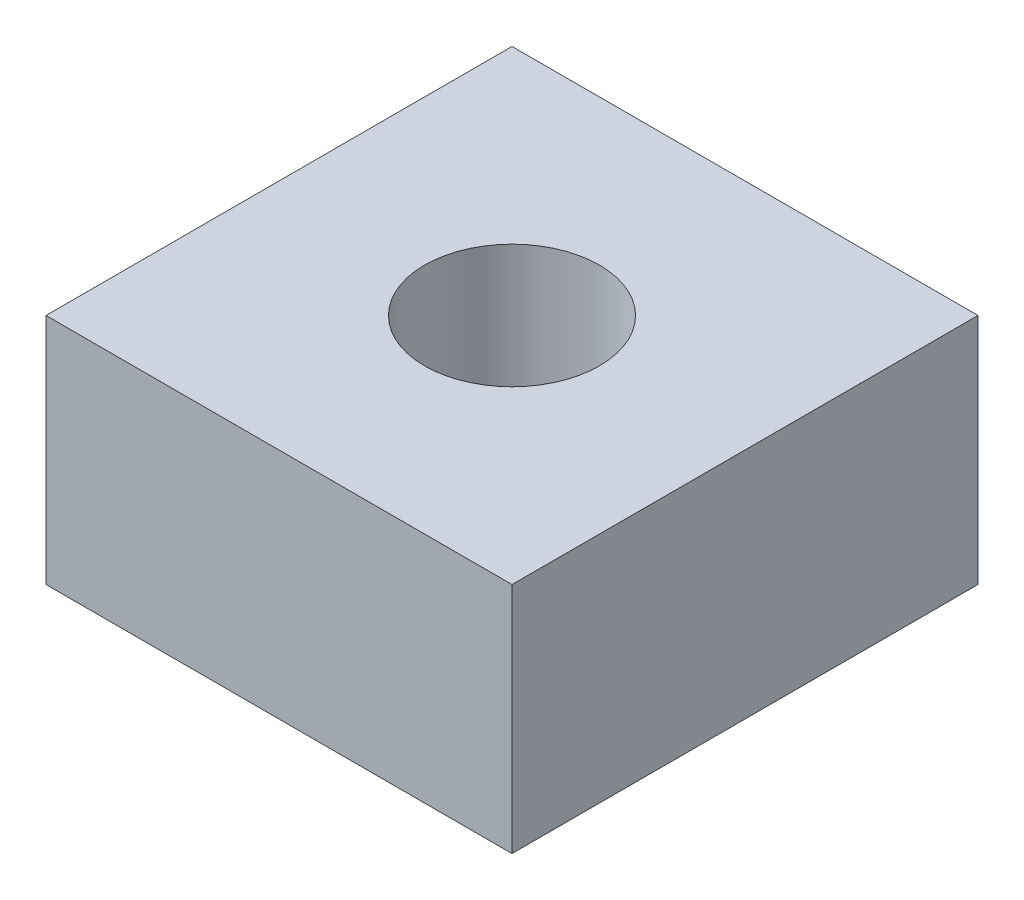
ISO-10303-21;
HEADER;
FILE_DESCRIPTION(('STEP AP214'),'2;1');
FILE_NAME('part.step','',(''),(''),'','','');
FILE_SCHEMA(('AUTOMOTIVE_DESIGN { 1 0 10303 214 1 1 1 1 }'));
ENDSEC;
DATA;
#1=APPLICATION_CONTEXT('core data for automotive mechanical design processes');
#2=APPLICATION_PROTOCOL_DEFINITION('international standard','automotive_design',2000,#1);
#3=PRODUCT_CONTEXT('',#1,'mechanical');
#4=PRODUCT('Part','Part','',(#3));
#5=PRODUCT_RELATED_PRODUCT_CATEGORY('part','',(#4));
#6=PRODUCT_DEFINITION_FORMATION('','',#4);
#7=PRODUCT_DEFINITION_CONTEXT('part definition',#1,'design');
#8=PRODUCT_DEFINITION('design','',#6,#7);
#9=PRODUCT_DEFINITION_SHAPE('','',#8);
#10=(LENGTH_UNIT() NAMED_UNIT(*) SI_UNIT(.MILLI.,.METRE.));
#11=(NAMED_UNIT(*) PLANE_ANGLE_UNIT() SI_UNIT($,.RADIAN.));
#12=(NAMED_UNIT(*) SI_UNIT($,.STERADIAN.) SOLID_ANGLE_UNIT());
#13=UNCERTAINTY_MEASURE_WITH_UNIT(LENGTH_MEASURE(1.E-05),#10,'distance_accuracy_value','');
#14=(GEOMETRIC_REPRESENTATION_CONTEXT(3) GLOBAL_UNCERTAINTY_ASSIGNED_CONTEXT((#13)) GLOBAL_UNIT_ASSIGNED_CONTEXT((#10,
#11,#12)) REPRESENTATION_CONTEXT('',''));
#15=CARTESIAN_POINT('',(0.,0.,0.));
#16=DIRECTION('',(0.,0.,1.));
#17=DIRECTION('',(1.,0.,0.));
#18=AXIS2_PLACEMENT_3D('',#15,#16,#17);
#19=CARTESIAN_POINT('',(0.,12.7,0.));
#20=DIRECTION('',(0.,-1.,0.));
#21=DIRECTION('',(0.,0.,-1.));
#22=AXIS2_PLACEMENT_3D('',#19,#20,#21);
#23=PLANE('',#22);
#24=DIRECTION('',(0.,0.,-1.));
#25=VECTOR('',#24,1.);
#26=CARTESIAN_POINT('',(12.7,12.7,12.7));
#27=LINE('',#26,#25);
#28=CARTESIAN_POINT('',(12.7,12.7,12.7));
#29=VERTEX_POINT('',#28);
#30=CARTESIAN_POINT('',(12.7,12.7,-12.7));
#31=VERTEX_POINT('',#30);
#32=EDGE_CURVE('E84',#29,#31,#27,.T.);
#33=ORIENTED_EDGE('',*,*,#32,.T.);
#34=DIRECTION('',(-1.,0.,0.));
#35=VECTOR('',#34,1.);
#36=CARTESIAN_POINT('',(-12.7,12.7,-12.7));
#37=LINE('',#36,#35);
#38=CARTESIAN_POINT('',(-12.7,12.7,-12.7));
#39=VERTEX_POINT('',#38);
#40=EDGE_CURVE('E79',#31,#39,#37,.T.);
#41=ORIENTED_EDGE('',*,*,#40,.T.);
#42=DIRECTION('',(0.,0.,1.));
#43=VECTOR('',#42,1.);
#44=CARTESIAN_POINT('',(-12.7,12.7,12.7));
#45=LINE('',#44,#43);
#46=CARTESIAN_POINT('',(-12.7,12.7,12.7));
#47=VERTEX_POINT('',#46);
#48=EDGE_CURVE('E82',#39,#47,#45,.T.);
#49=ORIENTED_EDGE('',*,*,#48,.T.);
#50=DIRECTION('',(1.,0.,0.));
#51=VECTOR('',#50,1.);
#52=CARTESIAN_POINT('',(-12.7,12.7,12.7));
#53=LINE('',#52,#51);
#54=EDGE_CURVE('E49',#47,#29,#53,.T.);
#55=ORIENTED_EDGE('',*,*,#54,.T.);
#56=EDGE_LOOP('',(#33,#41,#49,#55));
#57=FACE_BOUND('',#56,.T.);
#58=CARTESIAN_POINT('',(0.,12.7,0.));
#59=DIRECTION('',(0.,1.,0.));
#60=DIRECTION('',(0.,0.,1.));
#61=AXIS2_PLACEMENT_3D('',#58,#59,#60);
#62=CIRCLE('',#61,4.7625);
#63=CARTESIAN_POINT('',(0.,12.7,4.7625));
#64=VERTEX_POINT('',#63);
#65=EDGE_CURVE('E99',#64,#64,#62,.T.);
#66=ORIENTED_EDGE('',*,*,#65,.F.);
#67=EDGE_LOOP('',(#66));
#68=FACE_BOUND('',#67,.T.);
#69=ADVANCED_FACE('F32',(#57,#68),#23,.F.);
#70=CARTESIAN_POINT('',(0.,0.,0.));
#71=DIRECTION('',(0.,-1.,0.));
#72=DIRECTION('',(0.,0.,-1.));
#73=AXIS2_PLACEMENT_3D('',#70,#71,#72);
#74=PLANE('',#73);
#75=DIRECTION('',(0.,0.,-1.));
#76=VECTOR('',#75,1.);
#77=CARTESIAN_POINT('',(12.7,0.,12.7));
#78=LINE('',#77,#76);
#79=CARTESIAN_POINT('',(12.7,0.,12.7));
#80=VERTEX_POINT('',#79);
#81=CARTESIAN_POINT('',(12.7,0.,-12.7));
#82=VERTEX_POINT('',#81);
#83=EDGE_CURVE('E96',#80,#82,#78,.T.);
#84=ORIENTED_EDGE('',*,*,#83,.F.);
#85=DIRECTION('',(1.,0.,0.));
#86=VECTOR('',#85,1.);
#87=CARTESIAN_POINT('',(-12.7,0.,12.7));
#88=LINE('',#87,#86);
#89=CARTESIAN_POINT('',(-12.7,0.,12.7));
#90=VERTEX_POINT('',#89);
#91=EDGE_CURVE('E72',#90,#80,#88,.T.);
#92=ORIENTED_EDGE('',*,*,#91,.F.);
#93=DIRECTION('',(0.,0.,1.));
#94=VECTOR('',#93,1.);
#95=CARTESIAN_POINT('',(-12.7,0.,12.7));
#96=LINE('',#95,#94);
#97=CARTESIAN_POINT('',(-12.7,0.,-12.7));
#98=VERTEX_POINT('',#97);
#99=EDGE_CURVE('E66',#98,#90,#96,.T.);
#100=ORIENTED_EDGE('',*,*,#99,.F.);
#101=DIRECTION('',(-1.,0.,0.));
#102=VECTOR('',#101,1.);
#103=CARTESIAN_POINT('',(-12.7,0.,-12.7));
#104=LINE('',#103,#102);
#105=EDGE_CURVE('E88',#82,#98,#104,.T.);
#106=ORIENTED_EDGE('',*,*,#105,.F.);
#107=EDGE_LOOP('',(#84,#92,#100,#106));
#108=FACE_BOUND('',#107,.T.);
#109=CARTESIAN_POINT('',(0.,0.,0.));
#110=DIRECTION('',(0.,1.,0.));
#111=DIRECTION('',(0.,0.,1.));
#112=AXIS2_PLACEMENT_3D('',#109,#110,#111);
#113=CIRCLE('',#112,4.7625);
#114=CARTESIAN_POINT('',(0.,0.,4.7625));
#115=VERTEX_POINT('',#114);
#116=EDGE_CURVE('E111',#115,#115,#113,.T.);
#117=ORIENTED_EDGE('',*,*,#116,.T.);
#118=EDGE_LOOP('',(#117));
#119=FACE_BOUND('',#118,.T.);
#120=ADVANCED_FACE('F107',(#108,#119),#74,.T.);
#121=CARTESIAN_POINT('',(12.7,12.7,12.7));
#122=DIRECTION('',(-1.,0.,0.));
#123=DIRECTION('',(0.,0.,1.));
#124=AXIS2_PLACEMENT_3D('',#121,#122,#123);
#125=PLANE('',#124);
#126=ORIENTED_EDGE('',*,*,#83,.T.);
#127=DIRECTION('',(0.,-1.,0.));
#128=VECTOR('',#127,1.);
#129=CARTESIAN_POINT('',(12.7,12.7,-12.7));
#130=LINE('',#129,#128);
#131=EDGE_CURVE('E11',#31,#82,#130,.T.);
#132=ORIENTED_EDGE('',*,*,#131,.F.);
#133=ORIENTED_EDGE('',*,*,#32,.F.);
#134=DIRECTION('',(0.,-1.,0.));
#135=VECTOR('',#134,1.);
#136=CARTESIAN_POINT('',(12.7,12.7,12.7));
#137=LINE('',#136,#135);
#138=EDGE_CURVE('E92',#29,#80,#137,.T.);
#139=ORIENTED_EDGE('',*,*,#138,.T.);
#140=EDGE_LOOP('',(#126,#132,#133,#139));
#141=FACE_BOUND('',#140,.T.);
#142=ADVANCED_FACE('F34',(#141),#125,.F.);
#143=CARTESIAN_POINT('',(-12.7,12.7,-12.7));
#144=DIRECTION('',(0.,0.,1.));
#145=DIRECTION('',(1.,0.,0.));
#146=AXIS2_PLACEMENT_3D('',#143,#144,#145);
#147=PLANE('',#146);
#148=ORIENTED_EDGE('',*,*,#105,.T.);
#149=DIRECTION('',(0.,-1.,0.));
#150=VECTOR('',#149,1.);
#151=CARTESIAN_POINT('',(-12.7,12.7,-12.7));
#152=LINE('',#151,#150);
#153=EDGE_CURVE('E41',#39,#98,#152,.T.);
#154=ORIENTED_EDGE('',*,*,#153,.F.);
#155=ORIENTED_EDGE('',*,*,#40,.F.);
#156=ORIENTED_EDGE('',*,*,#131,.T.);
#157=EDGE_LOOP('',(#148,#154,#155,#156));
#158=FACE_BOUND('',#157,.T.);
#159=ADVANCED_FACE('F87',(#158),#147,.F.);
#160=CARTESIAN_POINT('',(-12.7,12.7,12.7));
#161=DIRECTION('',(1.,0.,0.));
#162=DIRECTION('',(0.,0.,-1.));
#163=AXIS2_PLACEMENT_3D('',#160,#161,#162);
#164=PLANE('',#163);
#165=ORIENTED_EDGE('',*,*,#99,.T.);
#166=DIRECTION('',(0.,-1.,0.));
#167=VECTOR('',#166,1.);
#168=CARTESIAN_POINT('',(-12.7,12.7,12.7));
#169=LINE('',#168,#167);
#170=EDGE_CURVE('E89',#47,#90,#169,.T.);
#171=ORIENTED_EDGE('',*,*,#170,.F.);
#172=ORIENTED_EDGE('',*,*,#48,.F.);
#173=ORIENTED_EDGE('',*,*,#153,.T.);
#174=EDGE_LOOP('',(#165,#171,#172,#173));
#175=FACE_BOUND('',#174,.T.);
#176=ADVANCED_FACE('F90',(#175),#164,.F.);
#177=CARTESIAN_POINT('',(-12.7,12.7,12.7));
#178=DIRECTION('',(0.,0.,-1.));
#179=DIRECTION('',(-1.,0.,0.));
#180=AXIS2_PLACEMENT_3D('',#177,#178,#179);
#181=PLANE('',#180);
#182=ORIENTED_EDGE('',*,*,#91,.T.);
#183=ORIENTED_EDGE('',*,*,#138,.F.);
#184=ORIENTED_EDGE('',*,*,#54,.F.);
#185=ORIENTED_EDGE('',*,*,#170,.T.);
#186=EDGE_LOOP('',(#182,#183,#184,#185));
#187=FACE_BOUND('',#186,.T.);
#188=ADVANCED_FACE('F104',(#187),#181,.F.);
#189=CARTESIAN_POINT('',(0.,12.7,0.));
#190=DIRECTION('',(0.,-1.,0.));
#191=DIRECTION('',(0.,0.,-1.));
#192=AXIS2_PLACEMENT_3D('',#189,#190,#191);
#193=CYLINDRICAL_SURFACE('',#192,4.7625);
#194=ORIENTED_EDGE('',*,*,#65,.T.);
#195=EDGE_LOOP('',(#194));
#196=FACE_BOUND('',#195,.T.);
#197=ORIENTED_EDGE('',*,*,#116,.F.);
#198=EDGE_LOOP('',(#197));
#199=FACE_BOUND('',#198,.T.);
#200=ADVANCED_FACE('F117',(#196,#199),#193,.F.);
#201=CLOSED_SHELL('',(#69,#120,#142,#159,#176,#188,#200));
#202=MANIFOLD_SOLID_BREP('B2',#201);
#203=ADVANCED_BREP_SHAPE_REPRESENTATION('',(#18,#202),#14);
#204=SHAPE_DEFINITION_REPRESENTATION(#9,#203);
ENDSEC;
END-ISO-10303-21;
